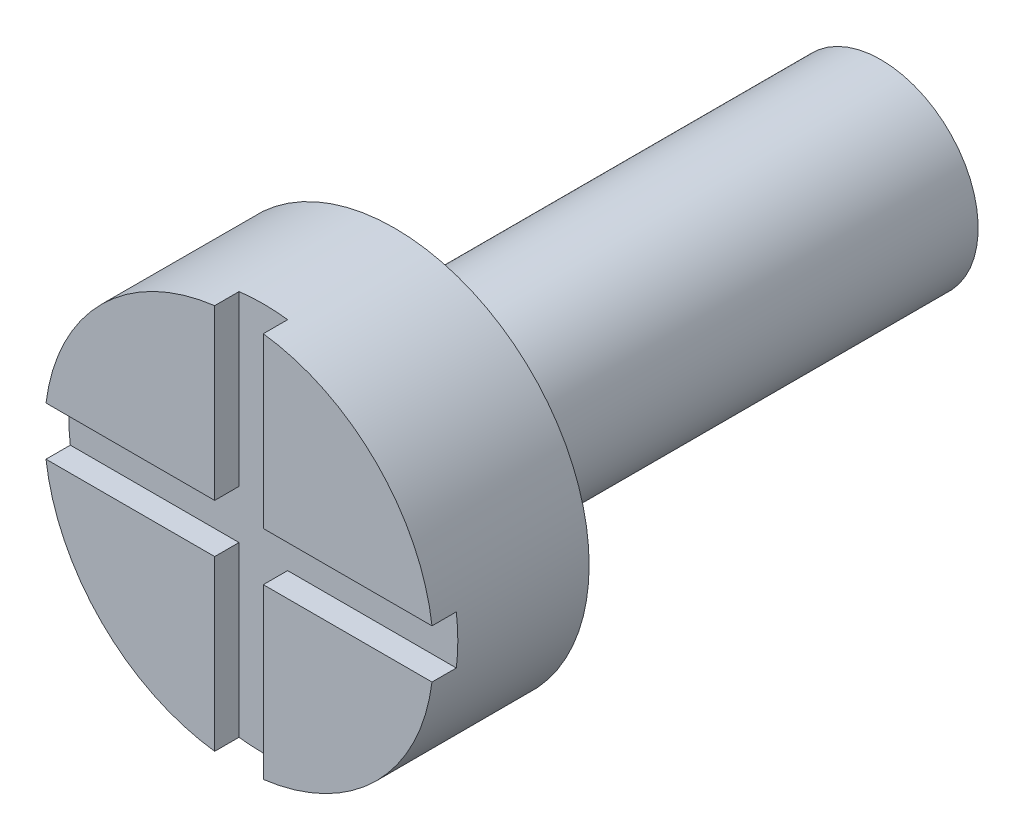
ISO-10303-21;
HEADER;
FILE_DESCRIPTION(('STEP AP214'),'2;1');
FILE_NAME('part.step','',(''),(''),'','','');
FILE_SCHEMA(('AUTOMOTIVE_DESIGN { 1 0 10303 214 1 1 1 1 }'));
ENDSEC;
DATA;
#1=APPLICATION_CONTEXT('core data for automotive mechanical design processes');
#2=APPLICATION_PROTOCOL_DEFINITION('international standard','automotive_design',2000,#1);
#3=PRODUCT_CONTEXT('',#1,'mechanical');
#4=PRODUCT('Part','Part','',(#3));
#5=PRODUCT_RELATED_PRODUCT_CATEGORY('part','',(#4));
#6=PRODUCT_DEFINITION_FORMATION('','',#4);
#7=PRODUCT_DEFINITION_CONTEXT('part definition',#1,'design');
#8=PRODUCT_DEFINITION('design','',#6,#7);
#9=PRODUCT_DEFINITION_SHAPE('','',#8);
#10=(LENGTH_UNIT() NAMED_UNIT(*) SI_UNIT(.MILLI.,.METRE.));
#11=(NAMED_UNIT(*) PLANE_ANGLE_UNIT() SI_UNIT($,.RADIAN.));
#12=(NAMED_UNIT(*) SI_UNIT($,.STERADIAN.) SOLID_ANGLE_UNIT());
#13=UNCERTAINTY_MEASURE_WITH_UNIT(LENGTH_MEASURE(1.E-05),#10,'distance_accuracy_value','');
#14=(GEOMETRIC_REPRESENTATION_CONTEXT(3) GLOBAL_UNCERTAINTY_ASSIGNED_CONTEXT((#13)) GLOBAL_UNIT_ASSIGNED_CONTEXT((#10,
#11,#12)) REPRESENTATION_CONTEXT('',''));
#15=CARTESIAN_POINT('',(0.,0.,0.));
#16=DIRECTION('',(0.,0.,1.));
#17=DIRECTION('',(1.,0.,0.));
#18=AXIS2_PLACEMENT_3D('',#15,#16,#17);
#19=CARTESIAN_POINT('',(0.,0.,-5.));
#20=DIRECTION('',(0.,0.,-1.));
#21=DIRECTION('',(0.,1.,0.));
#22=AXIS2_PLACEMENT_3D('',#19,#20,#21);
#23=CYLINDRICAL_SURFACE('',#22,2.);
#24=CARTESIAN_POINT('',(0.,0.,0.));
#25=DIRECTION('',(0.,0.,-1.));
#26=DIRECTION('',(0.,1.,0.));
#27=AXIS2_PLACEMENT_3D('',#24,#25,#26);
#28=CIRCLE('',#27,2.);
#29=CARTESIAN_POINT('',(0.,2.,0.));
#30=VERTEX_POINT('',#29);
#31=EDGE_CURVE('E184',#30,#30,#28,.T.);
#32=ORIENTED_EDGE('',*,*,#31,.F.);
#33=EDGE_LOOP('',(#32));
#34=FACE_BOUND('',#33,.T.);
#35=CARTESIAN_POINT('',(0.,0.,1.6));
#36=DIRECTION('',(0.,0.,-1.));
#37=DIRECTION('',(0.,1.,0.));
#38=AXIS2_PLACEMENT_3D('',#35,#36,#37);
#39=CIRCLE('',#38,2.);
#40=CARTESIAN_POINT('',(1.98431348329844,-0.25,1.6));
#41=VERTEX_POINT('',#40);
#42=CARTESIAN_POINT('',(0.25,-1.98431348329844,1.6));
#43=VERTEX_POINT('',#42);
#44=EDGE_CURVE('E198',#41,#43,#39,.T.);
#45=ORIENTED_EDGE('',*,*,#44,.T.);
#46=DIRECTION('',(0.,0.,-1.));
#47=VECTOR('',#46,1.);
#48=CARTESIAN_POINT('',(0.25,-1.98431348329844,-5.));
#49=LINE('',#48,#47);
#50=CARTESIAN_POINT('',(0.25,-1.98431348329844,1.35));
#51=VERTEX_POINT('',#50);
#52=EDGE_CURVE('E182',#43,#51,#49,.T.);
#53=ORIENTED_EDGE('',*,*,#52,.T.);
#54=CARTESIAN_POINT('',(0.,0.,1.35));
#55=DIRECTION('',(0.,0.,1.));
#56=DIRECTION('',(1.,0.,0.));
#57=AXIS2_PLACEMENT_3D('',#54,#55,#56);
#58=CIRCLE('',#57,2.);
#59=CARTESIAN_POINT('',(-0.25,-1.98431348329844,1.35));
#60=VERTEX_POINT('',#59);
#61=EDGE_CURVE('E11',#51,#60,#58,.F.);
#62=ORIENTED_EDGE('',*,*,#61,.T.);
#63=DIRECTION('',(0.,0.,-1.));
#64=VECTOR('',#63,1.);
#65=CARTESIAN_POINT('',(-0.25,-1.98431348329844,-5.));
#66=LINE('',#65,#64);
#67=CARTESIAN_POINT('',(-0.25,-1.98431348329844,1.6));
#68=VERTEX_POINT('',#67);
#69=EDGE_CURVE('E180',#68,#60,#66,.T.);
#70=ORIENTED_EDGE('',*,*,#69,.F.);
#71=CARTESIAN_POINT('',(-1.98431348329844,-0.25,1.6));
#72=VERTEX_POINT('',#71);
#73=EDGE_CURVE('E231',#68,#72,#39,.T.);
#74=ORIENTED_EDGE('',*,*,#73,.T.);
#75=DIRECTION('',(0.,0.,-1.));
#76=VECTOR('',#75,1.);
#77=CARTESIAN_POINT('',(-1.98431348329844,-0.25,-5.));
#78=LINE('',#77,#76);
#79=CARTESIAN_POINT('',(-1.98431348329844,-0.25,1.35));
#80=VERTEX_POINT('',#79);
#81=EDGE_CURVE('E178',#80,#72,#78,.F.);
#82=ORIENTED_EDGE('',*,*,#81,.F.);
#83=CARTESIAN_POINT('',(-1.98431348329844,0.25,1.35));
#84=VERTEX_POINT('',#83);
#85=EDGE_CURVE('E40',#80,#84,#58,.F.);
#86=ORIENTED_EDGE('',*,*,#85,.T.);
#87=DIRECTION('',(0.,0.,-1.));
#88=VECTOR('',#87,1.);
#89=CARTESIAN_POINT('',(-1.98431348329844,0.25,-5.));
#90=LINE('',#89,#88);
#91=CARTESIAN_POINT('',(-1.98431348329844,0.25,1.6));
#92=VERTEX_POINT('',#91);
#93=EDGE_CURVE('E175',#84,#92,#90,.F.);
#94=ORIENTED_EDGE('',*,*,#93,.T.);
#95=CARTESIAN_POINT('',(-0.25,1.98431348329844,1.6));
#96=VERTEX_POINT('',#95);
#97=EDGE_CURVE('E193',#92,#96,#39,.T.);
#98=ORIENTED_EDGE('',*,*,#97,.T.);
#99=DIRECTION('',(0.,0.,-1.));
#100=VECTOR('',#99,1.);
#101=CARTESIAN_POINT('',(-0.25,1.98431348329844,-5.));
#102=LINE('',#101,#100);
#103=CARTESIAN_POINT('',(-0.25,1.98431348329844,1.35));
#104=VERTEX_POINT('',#103);
#105=EDGE_CURVE('E173',#104,#96,#102,.F.);
#106=ORIENTED_EDGE('',*,*,#105,.F.);
#107=CARTESIAN_POINT('',(0.25,1.98431348329844,1.35));
#108=VERTEX_POINT('',#107);
#109=EDGE_CURVE('E209',#104,#108,#58,.F.);
#110=ORIENTED_EDGE('',*,*,#109,.T.);
#111=DIRECTION('',(0.,0.,-1.));
#112=VECTOR('',#111,1.);
#113=CARTESIAN_POINT('',(0.25,1.98431348329844,-5.));
#114=LINE('',#113,#112);
#115=CARTESIAN_POINT('',(0.25,1.98431348329844,1.6));
#116=VERTEX_POINT('',#115);
#117=EDGE_CURVE('E170',#108,#116,#114,.F.);
#118=ORIENTED_EDGE('',*,*,#117,.T.);
#119=CARTESIAN_POINT('',(1.98431348329844,0.249999999999999,1.6));
#120=VERTEX_POINT('',#119);
#121=EDGE_CURVE('E194',#116,#120,#39,.T.);
#122=ORIENTED_EDGE('',*,*,#121,.T.);
#123=DIRECTION('',(0.,0.,-1.));
#124=VECTOR('',#123,1.);
#125=CARTESIAN_POINT('',(1.98431348329844,0.249999999999999,-5.));
#126=LINE('',#125,#124);
#127=CARTESIAN_POINT('',(1.98431348329844,0.249999999999999,1.35));
#128=VERTEX_POINT('',#127);
#129=EDGE_CURVE('E167',#120,#128,#126,.T.);
#130=ORIENTED_EDGE('',*,*,#129,.T.);
#131=CARTESIAN_POINT('',(1.98431348329844,-0.25,1.35));
#132=VERTEX_POINT('',#131);
#133=EDGE_CURVE('E35',#128,#132,#58,.F.);
#134=ORIENTED_EDGE('',*,*,#133,.T.);
#135=DIRECTION('',(0.,0.,-1.));
#136=VECTOR('',#135,1.);
#137=CARTESIAN_POINT('',(1.98431348329844,-0.25,-5.));
#138=LINE('',#137,#136);
#139=EDGE_CURVE('E136',#41,#132,#138,.T.);
#140=ORIENTED_EDGE('',*,*,#139,.F.);
#141=EDGE_LOOP('',(#45,#53,#62,#70,#74,#82,#86,#94,#98,#106,#110,#118,#122,#130,#134,#140));
#142=FACE_BOUND('',#141,.T.);
#143=ADVANCED_FACE('F32',(#34,#142),#23,.T.);
#144=CARTESIAN_POINT('',(0.,2.,1.6));
#145=DIRECTION('',(0.,0.,1.));
#146=DIRECTION('',(0.,-1.,0.));
#147=AXIS2_PLACEMENT_3D('',#144,#145,#146);
#148=PLANE('',#147);
#149=ORIENTED_EDGE('',*,*,#97,.F.);
#150=DIRECTION('',(1.,0.,0.));
#151=VECTOR('',#150,1.);
#152=CARTESIAN_POINT('',(0.,0.25,1.6));
#153=LINE('',#152,#151);
#154=CARTESIAN_POINT('',(-0.25,0.249999999999999,1.6));
#155=VERTEX_POINT('',#154);
#156=EDGE_CURVE('E203',#92,#155,#153,.T.);
#157=ORIENTED_EDGE('',*,*,#156,.T.);
#158=DIRECTION('',(0.,-1.,0.));
#159=VECTOR('',#158,1.);
#160=CARTESIAN_POINT('',(-0.25,2.,1.6));
#161=LINE('',#160,#159);
#162=EDGE_CURVE('E201',#96,#155,#161,.T.);
#163=ORIENTED_EDGE('',*,*,#162,.F.);
#164=EDGE_LOOP('',(#149,#157,#163));
#165=FACE_BOUND('',#164,.T.);
#166=ADVANCED_FACE('F234',(#165),#148,.T.);
#167=ORIENTED_EDGE('',*,*,#121,.F.);
#168=DIRECTION('',(0.,-1.,0.));
#169=VECTOR('',#168,1.);
#170=CARTESIAN_POINT('',(0.25,2.,1.6));
#171=LINE('',#170,#169);
#172=CARTESIAN_POINT('',(0.25,0.249999999999999,1.6));
#173=VERTEX_POINT('',#172);
#174=EDGE_CURVE('E197',#116,#173,#171,.T.);
#175=ORIENTED_EDGE('',*,*,#174,.T.);
#176=DIRECTION('',(1.,0.,0.));
#177=VECTOR('',#176,1.);
#178=CARTESIAN_POINT('',(0.,0.249999999999999,1.6));
#179=LINE('',#178,#177);
#180=EDGE_CURVE('E155',#173,#120,#179,.T.);
#181=ORIENTED_EDGE('',*,*,#180,.T.);
#182=EDGE_LOOP('',(#167,#175,#181));
#183=FACE_BOUND('',#182,.T.);
#184=ADVANCED_FACE('F251',(#183),#148,.T.);
#185=DIRECTION('',(1.,0.,0.));
#186=VECTOR('',#185,1.);
#187=CARTESIAN_POINT('',(0.,-0.25,1.6));
#188=LINE('',#187,#186);
#189=CARTESIAN_POINT('',(0.25,-0.25,1.6));
#190=VERTEX_POINT('',#189);
#191=EDGE_CURVE('E153',#190,#41,#188,.T.);
#192=ORIENTED_EDGE('',*,*,#191,.F.);
#193=DIRECTION('',(0.,-1.,0.));
#194=VECTOR('',#193,1.);
#195=CARTESIAN_POINT('',(0.25,-4.54142135623731,1.6));
#196=LINE('',#195,#194);
#197=EDGE_CURVE('E47',#190,#43,#196,.T.);
#198=ORIENTED_EDGE('',*,*,#197,.T.);
#199=ORIENTED_EDGE('',*,*,#44,.F.);
#200=EDGE_LOOP('',(#192,#198,#199));
#201=FACE_BOUND('',#200,.T.);
#202=ADVANCED_FACE('F230',(#201),#148,.T.);
#203=DIRECTION('',(0.,-1.,0.));
#204=VECTOR('',#203,1.);
#205=CARTESIAN_POINT('',(-0.25,-4.54142135623731,1.6));
#206=LINE('',#205,#204);
#207=CARTESIAN_POINT('',(-0.25,-0.25,1.6));
#208=VERTEX_POINT('',#207);
#209=EDGE_CURVE('E132',#208,#68,#206,.T.);
#210=ORIENTED_EDGE('',*,*,#209,.F.);
#211=DIRECTION('',(1.,0.,0.));
#212=VECTOR('',#211,1.);
#213=CARTESIAN_POINT('',(0.,-0.25,1.6));
#214=LINE('',#213,#212);
#215=EDGE_CURVE('E205',#72,#208,#214,.T.);
#216=ORIENTED_EDGE('',*,*,#215,.F.);
#217=ORIENTED_EDGE('',*,*,#73,.F.);
#218=EDGE_LOOP('',(#210,#216,#217));
#219=FACE_BOUND('',#218,.T.);
#220=ADVANCED_FACE('F257',(#219),#148,.T.);
#221=CARTESIAN_POINT('',(0.,0.,-5.));
#222=DIRECTION('',(0.,0.,-1.));
#223=DIRECTION('',(0.,1.,0.));
#224=AXIS2_PLACEMENT_3D('',#221,#222,#223);
#225=PLANE('',#224);
#226=CARTESIAN_POINT('',(0.,0.,-5.));
#227=DIRECTION('',(0.,0.,-1.));
#228=DIRECTION('',(0.,1.,0.));
#229=AXIS2_PLACEMENT_3D('',#226,#227,#228);
#230=CIRCLE('',#229,1.);
#231=CARTESIAN_POINT('',(0.,1.,-5.));
#232=VERTEX_POINT('',#231);
#233=EDGE_CURVE('E190',#232,#232,#230,.T.);
#234=ORIENTED_EDGE('',*,*,#233,.T.);
#235=EDGE_LOOP('',(#234));
#236=FACE_BOUND('',#235,.T.);
#237=ADVANCED_FACE('F274',(#236),#225,.T.);
#238=CARTESIAN_POINT('',(0.,0.,-5.));
#239=DIRECTION('',(0.,0.,-1.));
#240=DIRECTION('',(0.,1.,0.));
#241=AXIS2_PLACEMENT_3D('',#238,#239,#240);
#242=CYLINDRICAL_SURFACE('',#241,1.);
#243=CARTESIAN_POINT('',(0.,0.,0.));
#244=DIRECTION('',(0.,0.,-1.));
#245=DIRECTION('',(0.,1.,0.));
#246=AXIS2_PLACEMENT_3D('',#243,#244,#245);
#247=CIRCLE('',#246,1.);
#248=CARTESIAN_POINT('',(0.,1.,0.));
#249=VERTEX_POINT('',#248);
#250=EDGE_CURVE('E187',#249,#249,#247,.T.);
#251=ORIENTED_EDGE('',*,*,#250,.T.);
#252=EDGE_LOOP('',(#251));
#253=FACE_BOUND('',#252,.T.);
#254=ORIENTED_EDGE('',*,*,#233,.F.);
#255=EDGE_LOOP('',(#254));
#256=FACE_BOUND('',#255,.T.);
#257=ADVANCED_FACE('F268',(#253,#256),#242,.T.);
#258=CARTESIAN_POINT('',(0.,1.,0.));
#259=DIRECTION('',(0.,0.,-1.));
#260=DIRECTION('',(0.,1.,0.));
#261=AXIS2_PLACEMENT_3D('',#258,#259,#260);
#262=PLANE('',#261);
#263=ORIENTED_EDGE('',*,*,#31,.T.);
#264=EDGE_LOOP('',(#263));
#265=FACE_BOUND('',#264,.T.);
#266=ORIENTED_EDGE('',*,*,#250,.F.);
#267=EDGE_LOOP('',(#266));
#268=FACE_BOUND('',#267,.T.);
#269=ADVANCED_FACE('F265',(#265,#268),#262,.T.);
#270=CARTESIAN_POINT('',(0.25,-4.54142135623731,1.35));
#271=DIRECTION('',(-1.,0.,0.));
#272=DIRECTION('',(0.,-1.,0.));
#273=AXIS2_PLACEMENT_3D('',#270,#271,#272);
#274=PLANE('',#273);
#275=ORIENTED_EDGE('',*,*,#197,.F.);
#276=DIRECTION('',(0.,0.,1.));
#277=VECTOR('',#276,1.);
#278=CARTESIAN_POINT('',(0.25,-0.25,1.35));
#279=LINE('',#278,#277);
#280=CARTESIAN_POINT('',(0.25,-0.25,1.35));
#281=VERTEX_POINT('',#280);
#282=EDGE_CURVE('E118',#281,#190,#279,.T.);
#283=ORIENTED_EDGE('',*,*,#282,.F.);
#284=DIRECTION('',(0.,-1.,0.));
#285=VECTOR('',#284,1.);
#286=CARTESIAN_POINT('',(0.25,-4.54142135623731,1.35));
#287=LINE('',#286,#285);
#288=EDGE_CURVE('E120',#281,#51,#287,.T.);
#289=ORIENTED_EDGE('',*,*,#288,.T.);
#290=ORIENTED_EDGE('',*,*,#52,.F.);
#291=EDGE_LOOP('',(#275,#283,#289,#290));
#292=FACE_BOUND('',#291,.T.);
#293=ADVANCED_FACE('F119',(#292),#274,.T.);
#294=CARTESIAN_POINT('',(-0.25,-4.54142135623731,1.35));
#295=DIRECTION('',(-1.,0.,0.));
#296=DIRECTION('',(0.,0.,1.));
#297=AXIS2_PLACEMENT_3D('',#294,#295,#296);
#298=PLANE('',#297);
#299=ORIENTED_EDGE('',*,*,#69,.T.);
#300=DIRECTION('',(0.,-1.,0.));
#301=VECTOR('',#300,1.);
#302=CARTESIAN_POINT('',(-0.25,-4.54142135623731,1.35));
#303=LINE('',#302,#301);
#304=CARTESIAN_POINT('',(-0.25,-0.25,1.35));
#305=VERTEX_POINT('',#304);
#306=EDGE_CURVE('E126',#305,#60,#303,.T.);
#307=ORIENTED_EDGE('',*,*,#306,.F.);
#308=DIRECTION('',(0.,0.,1.));
#309=VECTOR('',#308,1.);
#310=CARTESIAN_POINT('',(-0.25,-0.25,1.35));
#311=LINE('',#310,#309);
#312=EDGE_CURVE('E159',#305,#208,#311,.T.);
#313=ORIENTED_EDGE('',*,*,#312,.T.);
#314=ORIENTED_EDGE('',*,*,#209,.T.);
#315=EDGE_LOOP('',(#299,#307,#313,#314));
#316=FACE_BOUND('',#315,.T.);
#317=ADVANCED_FACE('F225',(#316),#298,.F.);
#318=CARTESIAN_POINT('',(0.,-0.25,1.35));
#319=DIRECTION('',(0.,-1.,0.));
#320=DIRECTION('',(1.,0.,0.));
#321=AXIS2_PLACEMENT_3D('',#318,#319,#320);
#322=PLANE('',#321);
#323=ORIENTED_EDGE('',*,*,#81,.T.);
#324=ORIENTED_EDGE('',*,*,#215,.T.);
#325=ORIENTED_EDGE('',*,*,#312,.F.);
#326=DIRECTION('',(1.,0.,0.));
#327=VECTOR('',#326,1.);
#328=CARTESIAN_POINT('',(0.,-0.25,1.35));
#329=LINE('',#328,#327);
#330=EDGE_CURVE('E149',#80,#305,#329,.T.);
#331=ORIENTED_EDGE('',*,*,#330,.F.);
#332=EDGE_LOOP('',(#323,#324,#325,#331));
#333=FACE_BOUND('',#332,.T.);
#334=ADVANCED_FACE('F221',(#333),#322,.F.);
#335=CARTESIAN_POINT('',(0.,0.25,1.35));
#336=DIRECTION('',(0.,-1.,0.));
#337=DIRECTION('',(1.,0.,0.));
#338=AXIS2_PLACEMENT_3D('',#335,#336,#337);
#339=PLANE('',#338);
#340=DIRECTION('',(1.,0.,0.));
#341=VECTOR('',#340,1.);
#342=CARTESIAN_POINT('',(0.,0.25,1.35));
#343=LINE('',#342,#341);
#344=CARTESIAN_POINT('',(-0.25,0.249999999999999,1.35));
#345=VERTEX_POINT('',#344);
#346=EDGE_CURVE('E147',#84,#345,#343,.T.);
#347=ORIENTED_EDGE('',*,*,#346,.T.);
#348=DIRECTION('',(0.,0.,1.));
#349=VECTOR('',#348,1.);
#350=CARTESIAN_POINT('',(-0.25,0.249999999999999,1.35));
#351=LINE('',#350,#349);
#352=EDGE_CURVE('E162',#345,#155,#351,.T.);
#353=ORIENTED_EDGE('',*,*,#352,.T.);
#354=ORIENTED_EDGE('',*,*,#156,.F.);
#355=ORIENTED_EDGE('',*,*,#93,.F.);
#356=EDGE_LOOP('',(#347,#353,#354,#355));
#357=FACE_BOUND('',#356,.T.);
#358=ADVANCED_FACE('F240',(#357),#339,.T.);
#359=CARTESIAN_POINT('',(-0.25,-4.54142135623731,1.35));
#360=DIRECTION('',(-1.,0.,0.));
#361=DIRECTION('',(0.,0.,1.));
#362=AXIS2_PLACEMENT_3D('',#359,#360,#361);
#363=PLANE('',#362);
#364=ORIENTED_EDGE('',*,*,#105,.T.);
#365=ORIENTED_EDGE('',*,*,#162,.T.);
#366=ORIENTED_EDGE('',*,*,#352,.F.);
#367=DIRECTION('',(0.,-1.,0.));
#368=VECTOR('',#367,1.);
#369=CARTESIAN_POINT('',(-0.25,-4.54142135623731,1.35));
#370=LINE('',#369,#368);
#371=EDGE_CURVE('E144',#104,#345,#370,.T.);
#372=ORIENTED_EDGE('',*,*,#371,.F.);
#373=EDGE_LOOP('',(#364,#365,#366,#372));
#374=FACE_BOUND('',#373,.T.);
#375=ADVANCED_FACE('F237',(#374),#363,.F.);
#376=CARTESIAN_POINT('',(0.25,-4.54142135623731,1.35));
#377=DIRECTION('',(-1.,0.,0.));
#378=DIRECTION('',(0.,0.,1.));
#379=AXIS2_PLACEMENT_3D('',#376,#377,#378);
#380=PLANE('',#379);
#381=DIRECTION('',(0.,-1.,0.));
#382=VECTOR('',#381,1.);
#383=CARTESIAN_POINT('',(0.25,-4.54142135623731,1.35));
#384=LINE('',#383,#382);
#385=CARTESIAN_POINT('',(0.25,0.249999999999999,1.35));
#386=VERTEX_POINT('',#385);
#387=EDGE_CURVE('E140',#108,#386,#384,.T.);
#388=ORIENTED_EDGE('',*,*,#387,.T.);
#389=DIRECTION('',(0.,0.,1.));
#390=VECTOR('',#389,1.);
#391=CARTESIAN_POINT('',(0.25,0.249999999999999,1.35));
#392=LINE('',#391,#390);
#393=EDGE_CURVE('E125',#386,#173,#392,.T.);
#394=ORIENTED_EDGE('',*,*,#393,.T.);
#395=ORIENTED_EDGE('',*,*,#174,.F.);
#396=ORIENTED_EDGE('',*,*,#117,.F.);
#397=EDGE_LOOP('',(#388,#394,#395,#396));
#398=FACE_BOUND('',#397,.T.);
#399=ADVANCED_FACE('F245',(#398),#380,.T.);
#400=CARTESIAN_POINT('',(0.,0.249999999999999,1.35));
#401=DIRECTION('',(0.,-1.,0.));
#402=DIRECTION('',(1.,0.,0.));
#403=AXIS2_PLACEMENT_3D('',#400,#401,#402);
#404=PLANE('',#403);
#405=ORIENTED_EDGE('',*,*,#180,.F.);
#406=ORIENTED_EDGE('',*,*,#393,.F.);
#407=DIRECTION('',(1.,0.,0.));
#408=VECTOR('',#407,1.);
#409=CARTESIAN_POINT('',(0.,0.249999999999999,1.35));
#410=LINE('',#409,#408);
#411=EDGE_CURVE('E137',#386,#128,#410,.T.);
#412=ORIENTED_EDGE('',*,*,#411,.T.);
#413=ORIENTED_EDGE('',*,*,#129,.F.);
#414=EDGE_LOOP('',(#405,#406,#412,#413));
#415=FACE_BOUND('',#414,.T.);
#416=ADVANCED_FACE('F248',(#415),#404,.T.);
#417=CARTESIAN_POINT('',(0.,-0.25,1.35));
#418=DIRECTION('',(0.,-1.,0.));
#419=DIRECTION('',(0.,0.,-1.));
#420=AXIS2_PLACEMENT_3D('',#417,#418,#419);
#421=PLANE('',#420);
#422=ORIENTED_EDGE('',*,*,#139,.T.);
#423=DIRECTION('',(1.,0.,0.));
#424=VECTOR('',#423,1.);
#425=CARTESIAN_POINT('',(0.,-0.25,1.35));
#426=LINE('',#425,#424);
#427=EDGE_CURVE('E130',#281,#132,#426,.T.);
#428=ORIENTED_EDGE('',*,*,#427,.F.);
#429=ORIENTED_EDGE('',*,*,#282,.T.);
#430=ORIENTED_EDGE('',*,*,#191,.T.);
#431=EDGE_LOOP('',(#422,#428,#429,#430));
#432=FACE_BOUND('',#431,.T.);
#433=ADVANCED_FACE('F134',(#432),#421,.F.);
#434=CARTESIAN_POINT('',(0.,-4.54142135623731,1.35));
#435=DIRECTION('',(0.,0.,1.));
#436=DIRECTION('',(1.,0.,0.));
#437=AXIS2_PLACEMENT_3D('',#434,#435,#436);
#438=PLANE('',#437);
#439=ORIENTED_EDGE('',*,*,#288,.F.);
#440=ORIENTED_EDGE('',*,*,#427,.T.);
#441=ORIENTED_EDGE('',*,*,#133,.F.);
#442=ORIENTED_EDGE('',*,*,#411,.F.);
#443=ORIENTED_EDGE('',*,*,#387,.F.);
#444=ORIENTED_EDGE('',*,*,#109,.F.);
#445=ORIENTED_EDGE('',*,*,#371,.T.);
#446=ORIENTED_EDGE('',*,*,#346,.F.);
#447=ORIENTED_EDGE('',*,*,#85,.F.);
#448=ORIENTED_EDGE('',*,*,#330,.T.);
#449=ORIENTED_EDGE('',*,*,#306,.T.);
#450=ORIENTED_EDGE('',*,*,#61,.F.);
#451=EDGE_LOOP('',(#439,#440,#441,#442,#443,#444,#445,#446,#447,#448,#449,#450));
#452=FACE_BOUND('',#451,.T.);
#453=ADVANCED_FACE('F129',(#452),#438,.T.);
#454=CLOSED_SHELL('',(#143,#166,#184,#202,#220,#237,#257,#269,#293,#317,#334,#358,#375,#399,
#416,#433,#453));
#455=MANIFOLD_SOLID_BREP('B2',#454);
#456=ADVANCED_BREP_SHAPE_REPRESENTATION('',(#18,#455),#14);
#457=SHAPE_DEFINITION_REPRESENTATION(#9,#456);
ENDSEC;
END-ISO-10303-21;
